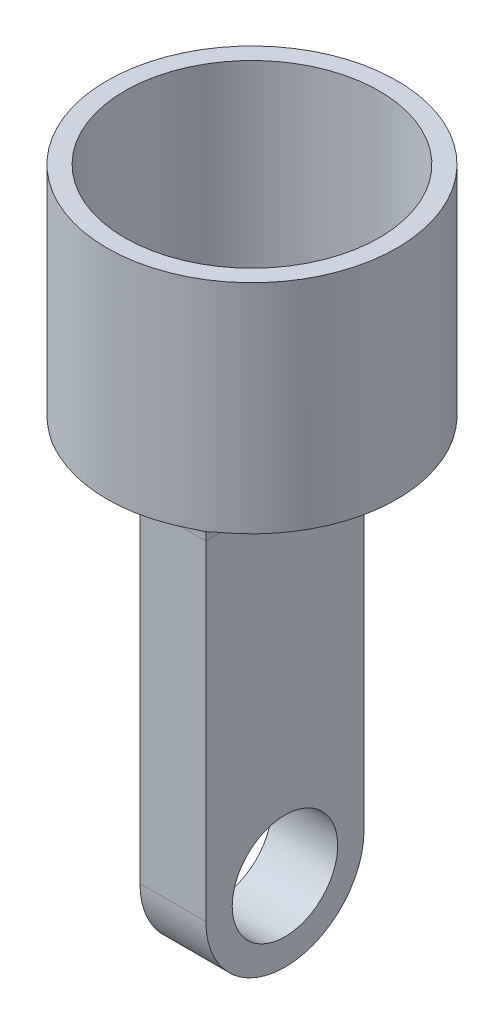
ISO-10303-21;
HEADER;
FILE_DESCRIPTION(('STEP AP214'),'2;1');
FILE_NAME('part.step','',(''),(''),'','','');
FILE_SCHEMA(('AUTOMOTIVE_DESIGN { 1 0 10303 214 1 1 1 1 }'));
ENDSEC;
DATA;
#1=APPLICATION_CONTEXT('core data for automotive mechanical design processes');
#2=APPLICATION_PROTOCOL_DEFINITION('international standard','automotive_design',2000,#1);
#3=PRODUCT_CONTEXT('',#1,'mechanical');
#4=PRODUCT('Part','Part','',(#3));
#5=PRODUCT_RELATED_PRODUCT_CATEGORY('part','',(#4));
#6=PRODUCT_DEFINITION_FORMATION('','',#4);
#7=PRODUCT_DEFINITION_CONTEXT('part definition',#1,'design');
#8=PRODUCT_DEFINITION('design','',#6,#7);
#9=PRODUCT_DEFINITION_SHAPE('','',#8);
#10=(LENGTH_UNIT() NAMED_UNIT(*) SI_UNIT(.MILLI.,.METRE.));
#11=(NAMED_UNIT(*) PLANE_ANGLE_UNIT() SI_UNIT($,.RADIAN.));
#12=(NAMED_UNIT(*) SI_UNIT($,.STERADIAN.) SOLID_ANGLE_UNIT());
#13=UNCERTAINTY_MEASURE_WITH_UNIT(LENGTH_MEASURE(1.E-05),#10,'distance_accuracy_value','');
#14=(GEOMETRIC_REPRESENTATION_CONTEXT(3) GLOBAL_UNCERTAINTY_ASSIGNED_CONTEXT((#13)) GLOBAL_UNIT_ASSIGNED_CONTEXT((#10,
#11,#12)) REPRESENTATION_CONTEXT('',''));
#15=CARTESIAN_POINT('',(0.,0.,0.));
#16=DIRECTION('',(0.,0.,1.));
#17=DIRECTION('',(1.,0.,0.));
#18=AXIS2_PLACEMENT_3D('',#15,#16,#17);
#19=CARTESIAN_POINT('',(0.,-1.5,0.));
#20=DIRECTION('',(0.,-1.,0.));
#21=DIRECTION('',(0.,0.,-1.));
#22=AXIS2_PLACEMENT_3D('',#19,#20,#21);
#23=PLANE('',#22);
#24=CARTESIAN_POINT('',(0.,-1.5,0.));
#25=DIRECTION('',(0.,-1.,0.));
#26=DIRECTION('',(0.,0.,-1.));
#27=AXIS2_PLACEMENT_3D('',#24,#25,#26);
#28=CIRCLE('',#27,11.);
#29=CARTESIAN_POINT('',(-4.58257569495583,-1.5,-10.));
#30=VERTEX_POINT('',#29);
#31=CARTESIAN_POINT('',(4.58257569495583,-1.5,-10.));
#32=VERTEX_POINT('',#31);
#33=EDGE_CURVE('E141',#30,#32,#28,.T.);
#34=ORIENTED_EDGE('',*,*,#33,.T.);
#35=DIRECTION('',(1.,0.,0.));
#36=VECTOR('',#35,1.);
#37=CARTESIAN_POINT('',(0.,-1.5,-10.));
#38=LINE('',#37,#36);
#39=EDGE_CURVE('E169',#32,#30,#38,.F.);
#40=ORIENTED_EDGE('',*,*,#39,.T.);
#41=EDGE_LOOP('',(#34,#40));
#42=FACE_BOUND('',#41,.T.);
#43=ADVANCED_FACE('F36',(#42),#23,.T.);
#44=CARTESIAN_POINT('',(6.5,-1.5,-8.87411967464942));
#45=VERTEX_POINT('',#44);
#46=CARTESIAN_POINT('',(6.5,-1.5,8.87411967464942));
#47=VERTEX_POINT('',#46);
#48=EDGE_CURVE('E150',#45,#47,#28,.T.);
#49=ORIENTED_EDGE('',*,*,#48,.T.);
#50=DIRECTION('',(0.,0.,1.));
#51=VECTOR('',#50,1.);
#52=CARTESIAN_POINT('',(6.5,-1.5,0.));
#53=LINE('',#52,#51);
#54=EDGE_CURVE('E167',#47,#45,#53,.F.);
#55=ORIENTED_EDGE('',*,*,#54,.T.);
#56=EDGE_LOOP('',(#49,#55));
#57=FACE_BOUND('',#56,.T.);
#58=ADVANCED_FACE('F289',(#57),#23,.T.);
#59=CARTESIAN_POINT('',(4.58257569495583,-1.5,10.));
#60=VERTEX_POINT('',#59);
#61=CARTESIAN_POINT('',(-4.58257569495584,-1.5,10.));
#62=VERTEX_POINT('',#61);
#63=EDGE_CURVE('E248',#60,#62,#28,.T.);
#64=ORIENTED_EDGE('',*,*,#63,.T.);
#65=DIRECTION('',(-1.,0.,0.));
#66=VECTOR('',#65,1.);
#67=CARTESIAN_POINT('',(0.,-1.5,10.));
#68=LINE('',#67,#66);
#69=EDGE_CURVE('E165',#62,#60,#68,.F.);
#70=ORIENTED_EDGE('',*,*,#69,.T.);
#71=EDGE_LOOP('',(#64,#70));
#72=FACE_BOUND('',#71,.T.);
#73=ADVANCED_FACE('F250',(#72),#23,.T.);
#74=CARTESIAN_POINT('',(2.5,-36.5,-6.));
#75=DIRECTION('',(-1.,0.,0.));
#76=DIRECTION('',(0.,0.,1.));
#77=AXIS2_PLACEMENT_3D('',#74,#75,#76);
#78=PLANE('',#77);
#79=CARTESIAN_POINT('',(2.5,-30.5,0.));
#80=DIRECTION('',(-1.,0.,0.));
#81=DIRECTION('',(0.,0.,1.));
#82=AXIS2_PLACEMENT_3D('',#79,#80,#81);
#83=CIRCLE('',#82,4.);
#84=CARTESIAN_POINT('',(2.5,-30.5,4.));
#85=VERTEX_POINT('',#84);
#86=EDGE_CURVE('E266',#85,#85,#83,.F.);
#87=ORIENTED_EDGE('',*,*,#86,.F.);
#88=EDGE_LOOP('',(#87));
#89=FACE_BOUND('',#88,.T.);
#90=DIRECTION('',(0.,1.,0.));
#91=VECTOR('',#90,1.);
#92=CARTESIAN_POINT('',(2.5,-36.5,-6.));
#93=LINE('',#92,#91);
#94=CARTESIAN_POINT('',(2.5,-30.5,-5.99999999999999));
#95=VERTEX_POINT('',#94);
#96=CARTESIAN_POINT('',(2.5,-5.5,-6.));
#97=VERTEX_POINT('',#96);
#98=EDGE_CURVE('E143',#95,#97,#93,.T.);
#99=ORIENTED_EDGE('',*,*,#98,.T.);
#100=DIRECTION('',(0.,0.,1.));
#101=VECTOR('',#100,1.);
#102=CARTESIAN_POINT('',(2.5,-5.5,-6.));
#103=LINE('',#102,#101);
#104=CARTESIAN_POINT('',(2.5,-5.5,6.));
#105=VERTEX_POINT('',#104);
#106=EDGE_CURVE('E172',#97,#105,#103,.T.);
#107=ORIENTED_EDGE('',*,*,#106,.T.);
#108=DIRECTION('',(0.,1.,0.));
#109=VECTOR('',#108,1.);
#110=CARTESIAN_POINT('',(2.5,-36.5,6.));
#111=LINE('',#110,#109);
#112=CARTESIAN_POINT('',(2.5,-30.5,6.));
#113=VERTEX_POINT('',#112);
#114=EDGE_CURVE('E139',#113,#105,#111,.T.);
#115=ORIENTED_EDGE('',*,*,#114,.F.);
#116=CARTESIAN_POINT('',(2.5,-30.5,0.));
#117=DIRECTION('',(-1.,0.,0.));
#118=DIRECTION('',(0.,0.,1.));
#119=AXIS2_PLACEMENT_3D('',#116,#117,#118);
#120=CIRCLE('',#119,6.);
#121=EDGE_CURVE('E130',#95,#113,#120,.T.);
#122=ORIENTED_EDGE('',*,*,#121,.F.);
#123=EDGE_LOOP('',(#99,#107,#115,#122));
#124=FACE_BOUND('',#123,.T.);
#125=ADVANCED_FACE('F265',(#89,#124),#78,.F.);
#126=CARTESIAN_POINT('',(-2.5,-36.5,6.));
#127=DIRECTION('',(0.,0.,-1.));
#128=DIRECTION('',(-1.,0.,0.));
#129=AXIS2_PLACEMENT_3D('',#126,#127,#128);
#130=PLANE('',#129);
#131=ORIENTED_EDGE('',*,*,#114,.T.);
#132=DIRECTION('',(-1.,0.,0.));
#133=VECTOR('',#132,1.);
#134=CARTESIAN_POINT('',(-2.5,-5.5,6.));
#135=LINE('',#134,#133);
#136=CARTESIAN_POINT('',(-2.5,-5.5,6.));
#137=VERTEX_POINT('',#136);
#138=EDGE_CURVE('E138',#105,#137,#135,.T.);
#139=ORIENTED_EDGE('',*,*,#138,.T.);
#140=DIRECTION('',(0.,1.,0.));
#141=VECTOR('',#140,1.);
#142=CARTESIAN_POINT('',(-2.5,-36.5,6.));
#143=LINE('',#142,#141);
#144=CARTESIAN_POINT('',(-2.5,-30.5,6.));
#145=VERTEX_POINT('',#144);
#146=EDGE_CURVE('E119',#145,#137,#143,.T.);
#147=ORIENTED_EDGE('',*,*,#146,.F.);
#148=DIRECTION('',(-1.,0.,0.));
#149=VECTOR('',#148,1.);
#150=CARTESIAN_POINT('',(11.,-30.5,6.));
#151=LINE('',#150,#149);
#152=EDGE_CURVE('E125',#113,#145,#151,.T.);
#153=ORIENTED_EDGE('',*,*,#152,.F.);
#154=EDGE_LOOP('',(#131,#139,#147,#153));
#155=FACE_BOUND('',#154,.T.);
#156=ADVANCED_FACE('F136',(#155),#130,.F.);
#157=CARTESIAN_POINT('',(-2.5,-36.5,-6.));
#158=DIRECTION('',(1.,0.,0.));
#159=DIRECTION('',(0.,0.,-1.));
#160=AXIS2_PLACEMENT_3D('',#157,#158,#159);
#161=PLANE('',#160);
#162=CARTESIAN_POINT('',(-2.5,-30.5,0.));
#163=DIRECTION('',(-1.,0.,0.));
#164=DIRECTION('',(0.,0.,1.));
#165=AXIS2_PLACEMENT_3D('',#162,#163,#164);
#166=CIRCLE('',#165,4.);
#167=CARTESIAN_POINT('',(-2.5,-30.5,4.));
#168=VERTEX_POINT('',#167);
#169=EDGE_CURVE('E268',#168,#168,#166,.T.);
#170=ORIENTED_EDGE('',*,*,#169,.F.);
#171=EDGE_LOOP('',(#170));
#172=FACE_BOUND('',#171,.T.);
#173=ORIENTED_EDGE('',*,*,#146,.T.);
#174=DIRECTION('',(0.,0.,-1.));
#175=VECTOR('',#174,1.);
#176=CARTESIAN_POINT('',(-2.5,-5.5,-6.));
#177=LINE('',#176,#175);
#178=CARTESIAN_POINT('',(-2.5,-5.5,-6.));
#179=VERTEX_POINT('',#178);
#180=EDGE_CURVE('E175',#137,#179,#177,.T.);
#181=ORIENTED_EDGE('',*,*,#180,.T.);
#182=DIRECTION('',(0.,1.,0.));
#183=VECTOR('',#182,1.);
#184=CARTESIAN_POINT('',(-2.5,-36.5,-6.));
#185=LINE('',#184,#183);
#186=CARTESIAN_POINT('',(-2.5,-30.5,-6.));
#187=VERTEX_POINT('',#186);
#188=EDGE_CURVE('E122',#187,#179,#185,.T.);
#189=ORIENTED_EDGE('',*,*,#188,.F.);
#190=CARTESIAN_POINT('',(-2.5,-30.5,0.));
#191=DIRECTION('',(-1.,0.,0.));
#192=DIRECTION('',(0.,0.,1.));
#193=AXIS2_PLACEMENT_3D('',#190,#191,#192);
#194=CIRCLE('',#193,6.);
#195=EDGE_CURVE('E115',#187,#145,#194,.T.);
#196=ORIENTED_EDGE('',*,*,#195,.T.);
#197=EDGE_LOOP('',(#173,#181,#189,#196));
#198=FACE_BOUND('',#197,.T.);
#199=ADVANCED_FACE('F117',(#172,#198),#161,.F.);
#200=CARTESIAN_POINT('',(-6.5,-1.5,8.87411967464942));
#201=VERTEX_POINT('',#200);
#202=CARTESIAN_POINT('',(-6.5,-1.5,-8.87411967464942));
#203=VERTEX_POINT('',#202);
#204=EDGE_CURVE('E149',#201,#203,#28,.T.);
#205=ORIENTED_EDGE('',*,*,#204,.T.);
#206=DIRECTION('',(0.,0.,-1.));
#207=VECTOR('',#206,1.);
#208=CARTESIAN_POINT('',(-6.5,-1.5,0.));
#209=LINE('',#208,#207);
#210=EDGE_CURVE('E163',#203,#201,#209,.F.);
#211=ORIENTED_EDGE('',*,*,#210,.T.);
#212=EDGE_LOOP('',(#205,#211));
#213=FACE_BOUND('',#212,.T.);
#214=ADVANCED_FACE('F254',(#213),#23,.T.);
#215=CARTESIAN_POINT('',(0.,15.,0.));
#216=DIRECTION('',(0.,1.,0.));
#217=DIRECTION('',(0.,0.,1.));
#218=AXIS2_PLACEMENT_3D('',#215,#216,#217);
#219=PLANE('',#218);
#220=CARTESIAN_POINT('',(0.,15.,0.));
#221=DIRECTION('',(0.,1.,0.));
#222=DIRECTION('',(0.,0.,1.));
#223=AXIS2_PLACEMENT_3D('',#220,#221,#222);
#224=CIRCLE('',#223,11.);
#225=CARTESIAN_POINT('',(0.,15.,11.));
#226=VERTEX_POINT('',#225);
#227=EDGE_CURVE('E154',#226,#226,#224,.T.);
#228=ORIENTED_EDGE('',*,*,#227,.T.);
#229=EDGE_LOOP('',(#228));
#230=FACE_BOUND('',#229,.T.);
#231=CARTESIAN_POINT('',(0.,15.,0.));
#232=DIRECTION('',(0.,1.,0.));
#233=DIRECTION('',(0.,0.,1.));
#234=AXIS2_PLACEMENT_3D('',#231,#232,#233);
#235=CIRCLE('',#234,9.652);
#236=CARTESIAN_POINT('',(0.,15.,9.652));
#237=VERTEX_POINT('',#236);
#238=EDGE_CURVE('E151',#237,#237,#235,.T.);
#239=ORIENTED_EDGE('',*,*,#238,.F.);
#240=EDGE_LOOP('',(#239));
#241=FACE_BOUND('',#240,.T.);
#242=ADVANCED_FACE('F284',(#230,#241),#219,.T.);
#243=CARTESIAN_POINT('',(0.,15.,0.));
#244=DIRECTION('',(0.,-1.,0.));
#245=DIRECTION('',(0.,0.,-1.));
#246=AXIS2_PLACEMENT_3D('',#243,#244,#245);
#247=CYLINDRICAL_SURFACE('',#246,11.);
#248=ORIENTED_EDGE('',*,*,#227,.F.);
#249=EDGE_LOOP('',(#248));
#250=FACE_BOUND('',#249,.T.);
#251=ORIENTED_EDGE('',*,*,#48,.F.);
#252=CARTESIAN_POINT('',(6.5,-1.5,-8.87411967464942));
#253=CARTESIAN_POINT('',(6.44526312946483,-1.49999979029853,-8.9142139928411));
#254=CARTESIAN_POINT('',(6.39015140369013,-1.50112360717886,-8.953801966045));
#255=CARTESIAN_POINT('',(6.2793608879703,-1.50570569004657,-9.03184393068904));
#256=CARTESIAN_POINT('',(6.22368316121361,-1.50916017156157,-9.07029965516257));
#257=CARTESIAN_POINT('',(6.11176401049791,-1.51848951385756,-9.14608700833046));
#258=CARTESIAN_POINT('',(6.05552257304588,-1.52436443270996,-9.18341861003166));
#259=CARTESIAN_POINT('',(5.94249607149635,-1.53863151190501,-9.25695960307236));
#260=CARTESIAN_POINT('',(5.88571027340342,-1.54702774112481,-9.29316707529084));
#261=CARTESIAN_POINT('',(5.82875319561206,-1.55672373176834,-9.32875319561206));
#262=B_SPLINE_CURVE_WITH_KNOTS('',3,(#252,#253,#254,#255,#256,#257,#258,#259,#260,#261),
.UNSPECIFIED.,.F.,.F.,(4,2,2,2,4),(0.,0.203543664180025,0.406757612393675,0.60997643642462,
0.813524992644063),.UNSPECIFIED.);
#263=CARTESIAN_POINT('',(5.82875319561206,-1.55672373176834,-9.32875319561206));
#264=VERTEX_POINT('',#263);
#265=EDGE_CURVE('E210',#45,#264,#262,.T.);
#266=ORIENTED_EDGE('',*,*,#265,.T.);
#267=CARTESIAN_POINT('',(5.82875319561206,-1.55672373176834,-9.32875319561206));
#268=CARTESIAN_POINT('',(5.72885682383299,-1.54610369927555,-9.39117352980932));
#269=CARTESIAN_POINT('',(5.62783010140479,-1.53725816471223,-9.45206213037463));
#270=CARTESIAN_POINT('',(5.42385834072288,-1.52267042334923,-9.57056078737427));
#271=CARTESIAN_POINT('',(5.3209164889468,-1.51692346850923,-9.62817573820721));
#272=CARTESIAN_POINT('',(5.11315285894764,-1.50805756910572,-9.74010236912808));
#273=CARTESIAN_POINT('',(5.00833115639632,-1.50493851899961,-9.79441418179623));
#274=CARTESIAN_POINT('',(4.79679634850451,-1.50091020168749,-9.89973405242362));
#275=CARTESIAN_POINT('',(4.69008058112065,-1.50000434194242,-9.95073689848944));
#276=CARTESIAN_POINT('',(4.58257569495583,-1.5,-10.));
#277=B_SPLINE_CURVE_WITH_KNOTS('',3,(#267,#268,#269,#270,#271,#272,#273,#274,#275,#276),
.UNSPECIFIED.,.F.,.F.,(4,2,2,2,4),(0.,0.354770187907241,0.708995195297795,1.06320597553246,
1.41796176127419),.UNSPECIFIED.);
#278=EDGE_CURVE('E177',#264,#32,#277,.T.);
#279=ORIENTED_EDGE('',*,*,#278,.T.);
#280=ORIENTED_EDGE('',*,*,#33,.F.);
#281=CARTESIAN_POINT('',(-4.58257569495583,-1.5,-10.));
#282=CARTESIAN_POINT('',(-4.69008058112065,-1.50000434194242,-9.95073689848944));
#283=CARTESIAN_POINT('',(-4.79679634850451,-1.50091020168749,-9.89973405242362));
#284=CARTESIAN_POINT('',(-5.00833115639632,-1.50493851899961,-9.79441418179623));
#285=CARTESIAN_POINT('',(-5.11315285894764,-1.50805756910572,-9.74010236912808));
#286=CARTESIAN_POINT('',(-5.32091648894681,-1.51692346850923,-9.62817573820721));
#287=CARTESIAN_POINT('',(-5.42385834072288,-1.52267042334923,-9.57056078737427));
#288=CARTESIAN_POINT('',(-5.62783010140479,-1.53725816471223,-9.45206213037463));
#289=CARTESIAN_POINT('',(-5.72885682383299,-1.54610369927555,-9.39117352980932));
#290=CARTESIAN_POINT('',(-5.82875319561206,-1.55672373176834,-9.32875319561206));
#291=B_SPLINE_CURVE_WITH_KNOTS('',3,(#281,#282,#283,#284,#285,#286,#287,#288,#289,#290),
.UNSPECIFIED.,.F.,.F.,(4,2,2,2,4),(0.,0.354755785741734,0.708966565976396,1.06319157336695,
1.41796176127419),.UNSPECIFIED.);
#292=CARTESIAN_POINT('',(-5.82875319561206,-1.55672373176834,-9.32875319561206));
#293=VERTEX_POINT('',#292);
#294=EDGE_CURVE('E184',#30,#293,#291,.T.);
#295=ORIENTED_EDGE('',*,*,#294,.T.);
#296=CARTESIAN_POINT('',(-5.82875319561206,-1.55672373176834,-9.32875319561206));
#297=CARTESIAN_POINT('',(-5.88571027340342,-1.54702774112481,-9.29316707529084));
#298=CARTESIAN_POINT('',(-5.94249607149635,-1.53863151190501,-9.25695960307235));
#299=CARTESIAN_POINT('',(-6.05552257304588,-1.52436443270996,-9.18341861003166));
#300=CARTESIAN_POINT('',(-6.11176401049791,-1.51848951385756,-9.14608700833046));
#301=CARTESIAN_POINT('',(-6.22368316121361,-1.50916017156157,-9.07029965516257));
#302=CARTESIAN_POINT('',(-6.2793608879703,-1.50570569004657,-9.03184393068904));
#303=CARTESIAN_POINT('',(-6.39015140369013,-1.50112360717886,-8.953801966045));
#304=CARTESIAN_POINT('',(-6.44526312946483,-1.49999979029853,-8.9142139928411));
#305=CARTESIAN_POINT('',(-6.5,-1.5,-8.87411967464942));
#306=B_SPLINE_CURVE_WITH_KNOTS('',3,(#296,#297,#298,#299,#300,#301,#302,#303,#304,#305),
.UNSPECIFIED.,.F.,.F.,(4,2,2,2,4),(0.,0.203548556219443,0.406767380250389,0.60998132846404,
0.813524992644066),.UNSPECIFIED.);
#307=EDGE_CURVE('E46',#293,#203,#306,.T.);
#308=ORIENTED_EDGE('',*,*,#307,.T.);
#309=ORIENTED_EDGE('',*,*,#204,.F.);
#310=CARTESIAN_POINT('',(-6.5,-1.5,8.87411967464942));
#311=CARTESIAN_POINT('',(-6.44526312946483,-1.49999979029853,8.9142139928411));
#312=CARTESIAN_POINT('',(-6.39015140369013,-1.50112360717886,8.953801966045));
#313=CARTESIAN_POINT('',(-6.2793608879703,-1.50570569004657,9.03184393068904));
#314=CARTESIAN_POINT('',(-6.22368316121361,-1.50916017156157,9.07029965516257));
#315=CARTESIAN_POINT('',(-6.11176401049791,-1.51848951385756,9.14608700833046));
#316=CARTESIAN_POINT('',(-6.05552257304588,-1.52436443270996,9.18341861003166));
#317=CARTESIAN_POINT('',(-5.94249607149635,-1.53863151190501,9.25695960307235));
#318=CARTESIAN_POINT('',(-5.88571027340342,-1.54702774112481,9.29316707529084));
#319=CARTESIAN_POINT('',(-5.82875319561206,-1.55672373176834,9.32875319561206));
#320=B_SPLINE_CURVE_WITH_KNOTS('',3,(#310,#311,#312,#313,#314,#315,#316,#317,#318,#319),
.UNSPECIFIED.,.F.,.F.,(4,2,2,2,4),(0.,0.203543664180025,0.406757612393675,0.609976436424619,
0.81352499264406),.UNSPECIFIED.);
#321=CARTESIAN_POINT('',(-5.82875319561206,-1.55672373176834,9.32875319561206));
#322=VERTEX_POINT('',#321);
#323=EDGE_CURVE('E11',#201,#322,#320,.T.);
#324=ORIENTED_EDGE('',*,*,#323,.T.);
#325=CARTESIAN_POINT('',(-5.82875319561206,-1.55672373176834,9.32875319561206));
#326=CARTESIAN_POINT('',(-5.728856823833,-1.54610369927555,9.39117352980932));
#327=CARTESIAN_POINT('',(-5.6278301014048,-1.53725816471222,9.45206213037463));
#328=CARTESIAN_POINT('',(-5.42385834072288,-1.52267042334923,9.57056078737427));
#329=CARTESIAN_POINT('',(-5.32091648894681,-1.51692346850923,9.62817573820721));
#330=CARTESIAN_POINT('',(-5.11315285894765,-1.50805756910572,9.74010236912808));
#331=CARTESIAN_POINT('',(-5.00833115639633,-1.50493851899961,9.79441418179622));
#332=CARTESIAN_POINT('',(-4.79679634850452,-1.50091020168749,9.89973405242362));
#333=CARTESIAN_POINT('',(-4.69008058112065,-1.50000434194242,9.95073689848944));
#334=CARTESIAN_POINT('',(-4.58257569495584,-1.5,10.));
#335=B_SPLINE_CURVE_WITH_KNOTS('',3,(#325,#326,#327,#328,#329,#330,#331,#332,#333,#334),
.UNSPECIFIED.,.F.,.F.,(4,2,2,2,4),(0.,0.354770187907239,0.708995195297793,1.06320597553245,
1.41796176127419),.UNSPECIFIED.);
#336=EDGE_CURVE('E215',#322,#62,#335,.T.);
#337=ORIENTED_EDGE('',*,*,#336,.T.);
#338=ORIENTED_EDGE('',*,*,#63,.F.);
#339=CARTESIAN_POINT('',(4.58257569495583,-1.5,10.));
#340=CARTESIAN_POINT('',(4.69008058112065,-1.50000434194242,9.95073689848945));
#341=CARTESIAN_POINT('',(4.79679634850451,-1.50091020168749,9.89973405242362));
#342=CARTESIAN_POINT('',(5.00833115639632,-1.50493851899961,9.79441418179623));
#343=CARTESIAN_POINT('',(5.11315285894764,-1.50805756910572,9.74010236912808));
#344=CARTESIAN_POINT('',(5.3209164889468,-1.51692346850923,9.62817573820721));
#345=CARTESIAN_POINT('',(5.42385834072288,-1.52267042334923,9.57056078737427));
#346=CARTESIAN_POINT('',(5.6278301014048,-1.53725816471223,9.45206213037463));
#347=CARTESIAN_POINT('',(5.72885682383299,-1.54610369927555,9.39117352980932));
#348=CARTESIAN_POINT('',(5.82875319561206,-1.55672373176834,9.32875319561206));
#349=B_SPLINE_CURVE_WITH_KNOTS('',3,(#339,#340,#341,#342,#343,#344,#345,#346,#347,#348),
.UNSPECIFIED.,.F.,.F.,(4,2,2,2,4),(0.,0.354755785741735,0.708966565976397,1.06319157336695,
1.41796176127419),.UNSPECIFIED.);
#350=CARTESIAN_POINT('',(5.82875319561206,-1.55672373176834,9.32875319561206));
#351=VERTEX_POINT('',#350);
#352=EDGE_CURVE('E59',#60,#351,#349,.T.);
#353=ORIENTED_EDGE('',*,*,#352,.T.);
#354=CARTESIAN_POINT('',(5.82875319561206,-1.55672373176834,9.32875319561206));
#355=CARTESIAN_POINT('',(5.88571027340342,-1.54702774112481,9.29316707529084));
#356=CARTESIAN_POINT('',(5.94249607149635,-1.53863151190501,9.25695960307235));
#357=CARTESIAN_POINT('',(6.05552257304588,-1.52436443270996,9.18341861003166));
#358=CARTESIAN_POINT('',(6.11176401049791,-1.51848951385756,9.14608700833046));
#359=CARTESIAN_POINT('',(6.22368316121361,-1.50916017156157,9.07029965516257));
#360=CARTESIAN_POINT('',(6.2793608879703,-1.50570569004657,9.03184393068904));
#361=CARTESIAN_POINT('',(6.39015140369013,-1.50112360717886,8.953801966045));
#362=CARTESIAN_POINT('',(6.44526312946483,-1.49999979029853,8.9142139928411));
#363=CARTESIAN_POINT('',(6.5,-1.5,8.87411967464942));
#364=B_SPLINE_CURVE_WITH_KNOTS('',3,(#354,#355,#356,#357,#358,#359,#360,#361,#362,#363),
.UNSPECIFIED.,.F.,.F.,(4,2,2,2,4),(0.,0.203548556219443,0.406767380250389,0.609981328464041,
0.813524992644067),.UNSPECIFIED.);
#365=EDGE_CURVE('E205',#351,#47,#364,.T.);
#366=ORIENTED_EDGE('',*,*,#365,.T.);
#367=EDGE_LOOP('',(#251,#266,#279,#280,#295,#308,#309,#324,#337,#338,#353,#366));
#368=FACE_BOUND('',#367,.T.);
#369=ADVANCED_FACE('F189',(#250,#368),#247,.T.);
#370=CARTESIAN_POINT('',(0.,15.,0.));
#371=DIRECTION('',(0.,-1.,0.));
#372=DIRECTION('',(0.,0.,-1.));
#373=AXIS2_PLACEMENT_3D('',#370,#371,#372);
#374=CYLINDRICAL_SURFACE('',#373,9.652);
#375=ORIENTED_EDGE('',*,*,#238,.T.);
#376=EDGE_LOOP('',(#375));
#377=FACE_BOUND('',#376,.T.);
#378=CARTESIAN_POINT('',(0.,0.,0.));
#379=DIRECTION('',(0.,1.,0.));
#380=DIRECTION('',(0.,0.,1.));
#381=AXIS2_PLACEMENT_3D('',#378,#379,#380);
#382=CIRCLE('',#381,9.652);
#383=CARTESIAN_POINT('',(0.,0.,9.652));
#384=VERTEX_POINT('',#383);
#385=EDGE_CURVE('E155',#384,#384,#382,.T.);
#386=ORIENTED_EDGE('',*,*,#385,.F.);
#387=EDGE_LOOP('',(#386));
#388=FACE_BOUND('',#387,.T.);
#389=ADVANCED_FACE('F300',(#377,#388),#374,.F.);
#390=CARTESIAN_POINT('',(0.,0.,0.));
#391=DIRECTION('',(0.,-1.,0.));
#392=DIRECTION('',(0.,0.,-1.));
#393=AXIS2_PLACEMENT_3D('',#390,#391,#392);
#394=PLANE('',#393);
#395=ORIENTED_EDGE('',*,*,#385,.T.);
#396=EDGE_LOOP('',(#395));
#397=FACE_BOUND('',#396,.T.);
#398=ADVANCED_FACE('F297',(#397),#394,.F.);
#399=CARTESIAN_POINT('',(-2.5,-36.5,-6.));
#400=DIRECTION('',(0.,0.,1.));
#401=DIRECTION('',(1.,0.,0.));
#402=AXIS2_PLACEMENT_3D('',#399,#400,#401);
#403=PLANE('',#402);
#404=ORIENTED_EDGE('',*,*,#188,.T.);
#405=DIRECTION('',(1.,0.,0.));
#406=VECTOR('',#405,1.);
#407=CARTESIAN_POINT('',(-2.5,-5.5,-6.));
#408=LINE('',#407,#406);
#409=EDGE_CURVE('E160',#179,#97,#408,.T.);
#410=ORIENTED_EDGE('',*,*,#409,.T.);
#411=ORIENTED_EDGE('',*,*,#98,.F.);
#412=DIRECTION('',(-1.,0.,0.));
#413=VECTOR('',#412,1.);
#414=CARTESIAN_POINT('',(11.,-30.5,-5.99999999999999));
#415=LINE('',#414,#413);
#416=EDGE_CURVE('E134',#95,#187,#415,.T.);
#417=ORIENTED_EDGE('',*,*,#416,.T.);
#418=EDGE_LOOP('',(#404,#410,#411,#417));
#419=FACE_BOUND('',#418,.T.);
#420=ADVANCED_FACE('F263',(#419),#403,.F.);
#421=CARTESIAN_POINT('',(13.8137084989848,-30.5,0.));
#422=DIRECTION('',(-1.,0.,0.));
#423=DIRECTION('',(0.,0.,1.));
#424=AXIS2_PLACEMENT_3D('',#421,#422,#423);
#425=CYLINDRICAL_SURFACE('',#424,4.);
#426=ORIENTED_EDGE('',*,*,#86,.T.);
#427=EDGE_LOOP('',(#426));
#428=FACE_BOUND('',#427,.T.);
#429=ORIENTED_EDGE('',*,*,#169,.T.);
#430=EDGE_LOOP('',(#429));
#431=FACE_BOUND('',#430,.T.);
#432=ADVANCED_FACE('F276',(#428,#431),#425,.F.);
#433=CARTESIAN_POINT('',(11.,-30.5,0.));
#434=DIRECTION('',(-1.,0.,0.));
#435=DIRECTION('',(0.,0.,1.));
#436=AXIS2_PLACEMENT_3D('',#433,#434,#435);
#437=CYLINDRICAL_SURFACE('',#436,6.);
#438=ORIENTED_EDGE('',*,*,#121,.T.);
#439=ORIENTED_EDGE('',*,*,#152,.T.);
#440=ORIENTED_EDGE('',*,*,#195,.F.);
#441=ORIENTED_EDGE('',*,*,#416,.F.);
#442=EDGE_LOOP('',(#438,#439,#440,#441));
#443=FACE_BOUND('',#442,.T.);
#444=ADVANCED_FACE('F128',(#443),#437,.T.);
#445=CARTESIAN_POINT('',(-2.5,-5.5,10.));
#446=DIRECTION('',(-1.,0.,0.));
#447=DIRECTION('',(0.,0.,1.));
#448=AXIS2_PLACEMENT_3D('',#445,#446,#447);
#449=CYLINDRICAL_SURFACE('',#448,4.);
#450=ORIENTED_EDGE('',*,*,#69,.F.);
#451=ORIENTED_EDGE('',*,*,#336,.F.);
#452=CARTESIAN_POINT('',(-6.5,-5.5,9.99999999999999));
#453=DIRECTION('',(-0.707106781186547,0.,-0.707106781186548));
#454=DIRECTION('',(-0.707106781186548,0.,0.707106781186547));
#455=AXIS2_PLACEMENT_3D('',#452,#453,#454);
#456=ELLIPSE('',#455,5.65685424949238,4.);
#457=EDGE_CURVE('E41',#137,#322,#456,.F.);
#458=ORIENTED_EDGE('',*,*,#457,.F.);
#459=ORIENTED_EDGE('',*,*,#138,.F.);
#460=CARTESIAN_POINT('',(6.5,-5.5,10.));
#461=DIRECTION('',(-0.707106781186548,0.,0.707106781186547));
#462=DIRECTION('',(0.707106781186547,0.,0.707106781186548));
#463=AXIS2_PLACEMENT_3D('',#460,#461,#462);
#464=ELLIPSE('',#463,5.65685424949238,4.);
#465=EDGE_CURVE('E235',#351,#105,#464,.T.);
#466=ORIENTED_EDGE('',*,*,#465,.F.);
#467=ORIENTED_EDGE('',*,*,#352,.F.);
#468=EDGE_LOOP('',(#450,#451,#458,#459,#466,#467));
#469=FACE_BOUND('',#468,.T.);
#470=ADVANCED_FACE('F38',(#469),#449,.F.);
#471=CARTESIAN_POINT('',(-6.5,-5.5,-6.));
#472=DIRECTION('',(0.,0.,-1.));
#473=DIRECTION('',(-1.,0.,0.));
#474=AXIS2_PLACEMENT_3D('',#471,#472,#473);
#475=CYLINDRICAL_SURFACE('',#474,4.);
#476=ORIENTED_EDGE('',*,*,#210,.F.);
#477=ORIENTED_EDGE('',*,*,#307,.F.);
#478=CARTESIAN_POINT('',(-6.5,-5.5,-10.));
#479=DIRECTION('',(0.707106781186547,0.,-0.707106781186548));
#480=DIRECTION('',(0.707106781186547,0.,0.707106781186547));
#481=AXIS2_PLACEMENT_3D('',#478,#479,#480);
#482=ELLIPSE('',#481,5.65685424949238,4.);
#483=EDGE_CURVE('E233',#179,#293,#482,.F.);
#484=ORIENTED_EDGE('',*,*,#483,.F.);
#485=ORIENTED_EDGE('',*,*,#180,.F.);
#486=ORIENTED_EDGE('',*,*,#457,.T.);
#487=ORIENTED_EDGE('',*,*,#323,.F.);
#488=EDGE_LOOP('',(#476,#477,#484,#485,#486,#487));
#489=FACE_BOUND('',#488,.T.);
#490=ADVANCED_FACE('F201',(#489),#475,.F.);
#491=CARTESIAN_POINT('',(6.5,-5.5,-6.));
#492=DIRECTION('',(0.,0.,1.));
#493=DIRECTION('',(1.,0.,0.));
#494=AXIS2_PLACEMENT_3D('',#491,#492,#493);
#495=CYLINDRICAL_SURFACE('',#494,4.);
#496=ORIENTED_EDGE('',*,*,#465,.T.);
#497=ORIENTED_EDGE('',*,*,#106,.F.);
#498=CARTESIAN_POINT('',(6.5,-5.5,-10.));
#499=DIRECTION('',(0.707106781186547,0.,0.707106781186547));
#500=DIRECTION('',(0.707106781186547,0.,-0.707106781186548));
#501=AXIS2_PLACEMENT_3D('',#498,#499,#500);
#502=ELLIPSE('',#501,5.65685424949238,4.);
#503=EDGE_CURVE('E231',#264,#97,#502,.T.);
#504=ORIENTED_EDGE('',*,*,#503,.F.);
#505=ORIENTED_EDGE('',*,*,#265,.F.);
#506=ORIENTED_EDGE('',*,*,#54,.F.);
#507=ORIENTED_EDGE('',*,*,#365,.F.);
#508=EDGE_LOOP('',(#496,#497,#504,#505,#506,#507));
#509=FACE_BOUND('',#508,.T.);
#510=ADVANCED_FACE('F196',(#509),#495,.F.);
#511=CARTESIAN_POINT('',(-2.5,-5.5,-10.));
#512=DIRECTION('',(1.,0.,0.));
#513=DIRECTION('',(0.,0.,-1.));
#514=AXIS2_PLACEMENT_3D('',#511,#512,#513);
#515=CYLINDRICAL_SURFACE('',#514,4.);
#516=ORIENTED_EDGE('',*,*,#294,.F.);
#517=ORIENTED_EDGE('',*,*,#39,.F.);
#518=ORIENTED_EDGE('',*,*,#278,.F.);
#519=ORIENTED_EDGE('',*,*,#503,.T.);
#520=ORIENTED_EDGE('',*,*,#409,.F.);
#521=ORIENTED_EDGE('',*,*,#483,.T.);
#522=EDGE_LOOP('',(#516,#517,#518,#519,#520,#521));
#523=FACE_BOUND('',#522,.T.);
#524=ADVANCED_FACE('F192',(#523),#515,.F.);
#525=CLOSED_SHELL('',(#43,#58,#73,#125,#156,#199,#214,#242,#369,#389,#398,#420,#432,#444,#470,
#490,#510,#524));
#526=MANIFOLD_SOLID_BREP('B2',#525);
#527=ADVANCED_BREP_SHAPE_REPRESENTATION('',(#18,#526),#14);
#528=SHAPE_DEFINITION_REPRESENTATION(#9,#527);
ENDSEC;
END-ISO-10303-21;
